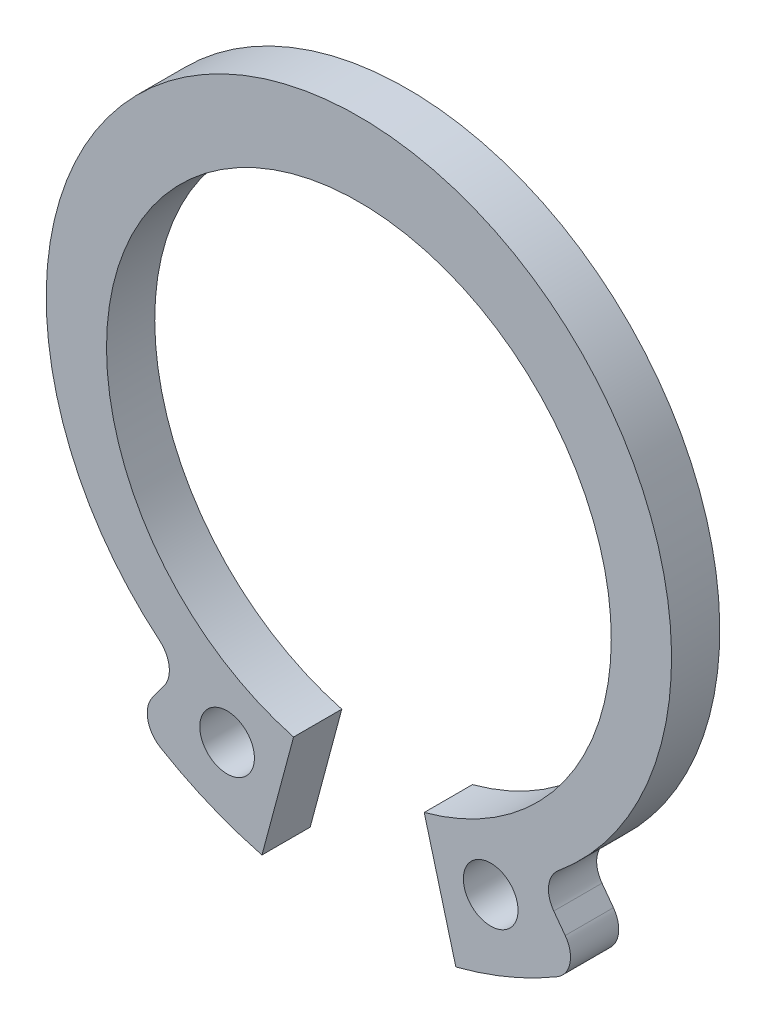
ISO-10303-21;
HEADER;
FILE_DESCRIPTION(('STEP AP214'),'2;1');
FILE_NAME('part.step','',(''),(''),'','','');
FILE_SCHEMA(('AUTOMOTIVE_DESIGN { 1 0 10303 214 1 1 1 1 }'));
ENDSEC;
DATA;
#1=APPLICATION_CONTEXT('core data for automotive mechanical design processes');
#2=APPLICATION_PROTOCOL_DEFINITION('international standard','automotive_design',2000,#1);
#3=PRODUCT_CONTEXT('',#1,'mechanical');
#4=PRODUCT('Part','Part','',(#3));
#5=PRODUCT_RELATED_PRODUCT_CATEGORY('part','',(#4));
#6=PRODUCT_DEFINITION_FORMATION('','',#4);
#7=PRODUCT_DEFINITION_CONTEXT('part definition',#1,'design');
#8=PRODUCT_DEFINITION('design','',#6,#7);
#9=PRODUCT_DEFINITION_SHAPE('','',#8);
#10=(LENGTH_UNIT() NAMED_UNIT(*) SI_UNIT(.MILLI.,.METRE.));
#11=(NAMED_UNIT(*) PLANE_ANGLE_UNIT() SI_UNIT($,.RADIAN.));
#12=(NAMED_UNIT(*) SI_UNIT($,.STERADIAN.) SOLID_ANGLE_UNIT());
#13=UNCERTAINTY_MEASURE_WITH_UNIT(LENGTH_MEASURE(1.E-05),#10,'distance_accuracy_value','');
#14=(GEOMETRIC_REPRESENTATION_CONTEXT(3) GLOBAL_UNCERTAINTY_ASSIGNED_CONTEXT((#13)) GLOBAL_UNIT_ASSIGNED_CONTEXT((#10,
#11,#12)) REPRESENTATION_CONTEXT('',''));
#15=CARTESIAN_POINT('',(0.,0.,0.));
#16=DIRECTION('',(0.,0.,1.));
#17=DIRECTION('',(1.,0.,0.));
#18=AXIS2_PLACEMENT_3D('',#15,#16,#17);
#19=CARTESIAN_POINT('',(-6.74585074112684,-7.71896235124148,1.5));
#20=DIRECTION('',(0.,0.,-1.));
#21=DIRECTION('',(-1.,0.,0.));
#22=AXIS2_PLACEMENT_3D('',#19,#20,#21);
#23=PLANE('',#22);
#24=CARTESIAN_POINT('',(4.09950189445806,-8.76125183465633,1.5));
#25=DIRECTION('',(0.,0.,1.));
#26=DIRECTION('',(1.,0.,0.));
#27=AXIS2_PLACEMENT_3D('',#24,#25,#26);
#28=CIRCLE('',#27,0.85);
#29=CARTESIAN_POINT('',(4.94950189445806,-8.76125183465633,1.5));
#30=VERTEX_POINT('',#29);
#31=EDGE_CURVE('E139',#30,#30,#28,.T.);
#32=ORIENTED_EDGE('',*,*,#31,.F.);
#33=EDGE_LOOP('',(#32));
#34=FACE_BOUND('',#33,.T.);
#35=CARTESIAN_POINT('',(-6.74585074112684,-7.71896235124148,1.5));
#36=DIRECTION('',(0.,0.,-1.));
#37=DIRECTION('',(-1.,0.,0.));
#38=AXIS2_PLACEMENT_3D('',#35,#36,#37);
#39=CIRCLE('',#38,0.849999999999999);
#40=CARTESIAN_POINT('',(-6.20363105980696,-7.06436490456959,1.5));
#41=VERTEX_POINT('',#40);
#42=CARTESIAN_POINT('',(-6.06164733846507,-8.22330916027874,1.5));
#43=VERTEX_POINT('',#42);
#44=EDGE_CURVE('E165',#41,#43,#39,.T.);
#45=ORIENTED_EDGE('',*,*,#44,.T.);
#46=DIRECTION('',(-0.593349187102657,-0.804945179602076,0.));
#47=VECTOR('',#46,1.);
#48=CARTESIAN_POINT('',(-6.06164733846507,-8.22330916027874,1.5));
#49=LINE('',#48,#47);
#50=CARTESIAN_POINT('',(-6.41683923197664,-8.70516707587138,1.5));
#51=VERTEX_POINT('',#50);
#52=EDGE_CURVE('E134',#43,#51,#49,.T.);
#53=ORIENTED_EDGE('',*,*,#52,.T.);
#54=CARTESIAN_POINT('',(-5.73263582931488,-9.20951388490864,1.5));
#55=DIRECTION('',(0.,0.,1.));
#56=DIRECTION('',(-1.,0.,0.));
#57=AXIS2_PLACEMENT_3D('',#54,#55,#56);
#58=CIRCLE('',#57,0.850000000000001);
#59=CARTESIAN_POINT('',(-6.16727428486132,-9.93998593294347,1.5));
#60=VERTEX_POINT('',#59);
#61=EDGE_CURVE('E168',#51,#60,#58,.T.);
#62=ORIENTED_EDGE('',*,*,#61,.T.);
#63=CARTESIAN_POINT('',(0.,0.425,1.5));
#64=DIRECTION('',(0.,0.,1.));
#65=DIRECTION('',(1.,0.,0.));
#66=AXIS2_PLACEMENT_3D('',#63,#64,#65);
#67=CIRCLE('',#66,12.0610200851681);
#68=CARTESIAN_POINT('',(-3.01524187544438,-11.2530358762677,1.5));
#69=VERTEX_POINT('',#68);
#70=EDGE_CURVE('E170',#60,#69,#67,.T.);
#71=ORIENTED_EDGE('',*,*,#70,.T.);
#72=DIRECTION('',(0.258819045102522,0.965925826289069,0.));
#73=VECTOR('',#72,1.);
#74=CARTESIAN_POINT('',(-2.03172950405479,-7.58251773636919,1.5));
#75=LINE('',#74,#73);
#76=CARTESIAN_POINT('',(-2.03172950405479,-7.58251773636919,1.5));
#77=VERTEX_POINT('',#76);
#78=EDGE_CURVE('E172',#69,#77,#75,.T.);
#79=ORIENTED_EDGE('',*,*,#78,.T.);
#80=CARTESIAN_POINT('',(0.,0.,1.5));
#81=DIRECTION('',(0.,0.,-1.));
#82=DIRECTION('',(1.,0.,0.));
#83=AXIS2_PLACEMENT_3D('',#80,#81,#82);
#84=CIRCLE('',#83,7.85);
#85=CARTESIAN_POINT('',(2.03172950405479,-7.58251773636919,1.5));
#86=VERTEX_POINT('',#85);
#87=EDGE_CURVE('E174',#77,#86,#84,.T.);
#88=ORIENTED_EDGE('',*,*,#87,.T.);
#89=DIRECTION('',(0.258819045102522,-0.965925826289069,0.));
#90=VECTOR('',#89,1.);
#91=CARTESIAN_POINT('',(2.03172950405479,-7.58251773636919,1.5));
#92=LINE('',#91,#90);
#93=CARTESIAN_POINT('',(3.01524187544438,-11.2530358762677,1.5));
#94=VERTEX_POINT('',#93);
#95=EDGE_CURVE('E176',#86,#94,#92,.T.);
#96=ORIENTED_EDGE('',*,*,#95,.T.);
#97=CARTESIAN_POINT('',(0.,0.425,1.5));
#98=DIRECTION('',(0.,0.,1.));
#99=DIRECTION('',(1.,0.,0.));
#100=AXIS2_PLACEMENT_3D('',#97,#98,#99);
#101=CIRCLE('',#100,12.0610200851681);
#102=CARTESIAN_POINT('',(6.16727428486133,-9.93998593294347,1.5));
#103=VERTEX_POINT('',#102);
#104=EDGE_CURVE('E178',#94,#103,#101,.T.);
#105=ORIENTED_EDGE('',*,*,#104,.T.);
#106=CARTESIAN_POINT('',(5.73263582931488,-9.20951388490863,1.5));
#107=DIRECTION('',(0.,0.,1.));
#108=DIRECTION('',(1.,0.,0.));
#109=AXIS2_PLACEMENT_3D('',#106,#107,#108);
#110=CIRCLE('',#109,0.850000000000001);
#111=CARTESIAN_POINT('',(6.41683923197664,-8.70516707587137,1.5));
#112=VERTEX_POINT('',#111);
#113=EDGE_CURVE('E180',#103,#112,#110,.T.);
#114=ORIENTED_EDGE('',*,*,#113,.T.);
#115=DIRECTION('',(-0.593349187102657,0.804945179602075,0.));
#116=VECTOR('',#115,1.);
#117=CARTESIAN_POINT('',(6.06164733846507,-8.22330916027874,1.5));
#118=LINE('',#117,#116);
#119=CARTESIAN_POINT('',(6.06164733846507,-8.22330916027874,1.5));
#120=VERTEX_POINT('',#119);
#121=EDGE_CURVE('E182',#112,#120,#118,.T.);
#122=ORIENTED_EDGE('',*,*,#121,.T.);
#123=CARTESIAN_POINT('',(6.74585074112684,-7.71896235124149,1.5));
#124=DIRECTION('',(0.,0.,-1.));
#125=DIRECTION('',(1.,0.,0.));
#126=AXIS2_PLACEMENT_3D('',#123,#124,#125);
#127=CIRCLE('',#126,0.849999999999999);
#128=CARTESIAN_POINT('',(6.20363105980695,-7.06436490456959,1.5));
#129=VERTEX_POINT('',#128);
#130=EDGE_CURVE('E51',#120,#129,#127,.T.);
#131=ORIENTED_EDGE('',*,*,#130,.T.);
#132=CARTESIAN_POINT('',(0.,0.425,1.5));
#133=DIRECTION('',(0.,0.,1.));
#134=DIRECTION('',(1.,0.,0.));
#135=AXIS2_PLACEMENT_3D('',#132,#133,#134);
#136=CIRCLE('',#135,9.725);
#137=EDGE_CURVE('E46',#129,#41,#136,.T.);
#138=ORIENTED_EDGE('',*,*,#137,.T.);
#139=EDGE_LOOP('',(#45,#53,#62,#71,#79,#88,#96,#105,#114,#122,#131,#138));
#140=FACE_BOUND('',#139,.T.);
#141=CARTESIAN_POINT('',(-4.09950189445806,-8.76125183465633,1.5));
#142=DIRECTION('',(0.,0.,1.));
#143=DIRECTION('',(-1.,0.,0.));
#144=AXIS2_PLACEMENT_3D('',#141,#142,#143);
#145=CIRCLE('',#144,0.85);
#146=CARTESIAN_POINT('',(-4.94950189445806,-8.76125183465633,1.5));
#147=VERTEX_POINT('',#146);
#148=EDGE_CURVE('E285',#147,#147,#145,.T.);
#149=ORIENTED_EDGE('',*,*,#148,.F.);
#150=EDGE_LOOP('',(#149));
#151=FACE_BOUND('',#150,.T.);
#152=ADVANCED_FACE('F31',(#34,#140,#151),#23,.F.);
#153=CARTESIAN_POINT('',(-6.74585074112684,-7.71896235124148,0.));
#154=DIRECTION('',(0.,0.,-1.));
#155=DIRECTION('',(-1.,0.,0.));
#156=AXIS2_PLACEMENT_3D('',#153,#154,#155);
#157=PLANE('',#156);
#158=CARTESIAN_POINT('',(4.09950189445806,-8.76125183465633,0.));
#159=DIRECTION('',(0.,0.,1.));
#160=DIRECTION('',(1.,0.,0.));
#161=AXIS2_PLACEMENT_3D('',#158,#159,#160);
#162=CIRCLE('',#161,0.85);
#163=CARTESIAN_POINT('',(4.94950189445806,-8.76125183465633,0.));
#164=VERTEX_POINT('',#163);
#165=EDGE_CURVE('E142',#164,#164,#162,.T.);
#166=ORIENTED_EDGE('',*,*,#165,.T.);
#167=EDGE_LOOP('',(#166));
#168=FACE_BOUND('',#167,.T.);
#169=CARTESIAN_POINT('',(-6.74585074112684,-7.71896235124148,0.));
#170=DIRECTION('',(0.,0.,-1.));
#171=DIRECTION('',(-1.,0.,0.));
#172=AXIS2_PLACEMENT_3D('',#169,#170,#171);
#173=CIRCLE('',#172,0.849999999999999);
#174=CARTESIAN_POINT('',(-6.20363105980696,-7.06436490456959,0.));
#175=VERTEX_POINT('',#174);
#176=CARTESIAN_POINT('',(-6.06164733846507,-8.22330916027874,0.));
#177=VERTEX_POINT('',#176);
#178=EDGE_CURVE('E125',#175,#177,#173,.T.);
#179=ORIENTED_EDGE('',*,*,#178,.F.);
#180=CARTESIAN_POINT('',(0.,0.425,0.));
#181=DIRECTION('',(0.,0.,1.));
#182=DIRECTION('',(1.,0.,0.));
#183=AXIS2_PLACEMENT_3D('',#180,#181,#182);
#184=CIRCLE('',#183,9.725);
#185=CARTESIAN_POINT('',(6.20363105980695,-7.06436490456959,0.));
#186=VERTEX_POINT('',#185);
#187=EDGE_CURVE('E163',#186,#175,#184,.T.);
#188=ORIENTED_EDGE('',*,*,#187,.F.);
#189=CARTESIAN_POINT('',(6.74585074112684,-7.71896235124149,0.));
#190=DIRECTION('',(0.,0.,-1.));
#191=DIRECTION('',(1.,0.,0.));
#192=AXIS2_PLACEMENT_3D('',#189,#190,#191);
#193=CIRCLE('',#192,0.849999999999999);
#194=CARTESIAN_POINT('',(6.06164733846507,-8.22330916027874,0.));
#195=VERTEX_POINT('',#194);
#196=EDGE_CURVE('E161',#195,#186,#193,.T.);
#197=ORIENTED_EDGE('',*,*,#196,.F.);
#198=DIRECTION('',(-0.593349187102657,0.804945179602075,0.));
#199=VECTOR('',#198,1.);
#200=CARTESIAN_POINT('',(6.06164733846507,-8.22330916027874,0.));
#201=LINE('',#200,#199);
#202=CARTESIAN_POINT('',(6.41683923197664,-8.70516707587137,0.));
#203=VERTEX_POINT('',#202);
#204=EDGE_CURVE('E159',#203,#195,#201,.T.);
#205=ORIENTED_EDGE('',*,*,#204,.F.);
#206=CARTESIAN_POINT('',(5.73263582931488,-9.20951388490863,0.));
#207=DIRECTION('',(0.,0.,1.));
#208=DIRECTION('',(1.,0.,0.));
#209=AXIS2_PLACEMENT_3D('',#206,#207,#208);
#210=CIRCLE('',#209,0.850000000000001);
#211=CARTESIAN_POINT('',(6.16727428486133,-9.93998593294347,0.));
#212=VERTEX_POINT('',#211);
#213=EDGE_CURVE('E157',#212,#203,#210,.T.);
#214=ORIENTED_EDGE('',*,*,#213,.F.);
#215=CARTESIAN_POINT('',(0.,0.425,0.));
#216=DIRECTION('',(0.,0.,1.));
#217=DIRECTION('',(1.,0.,0.));
#218=AXIS2_PLACEMENT_3D('',#215,#216,#217);
#219=CIRCLE('',#218,12.0610200851681);
#220=CARTESIAN_POINT('',(3.01524187544438,-11.2530358762677,0.));
#221=VERTEX_POINT('',#220);
#222=EDGE_CURVE('E155',#221,#212,#219,.T.);
#223=ORIENTED_EDGE('',*,*,#222,.F.);
#224=DIRECTION('',(0.258819045102522,-0.965925826289069,0.));
#225=VECTOR('',#224,1.);
#226=CARTESIAN_POINT('',(2.03172950405479,-7.58251773636919,0.));
#227=LINE('',#226,#225);
#228=CARTESIAN_POINT('',(2.03172950405479,-7.58251773636919,0.));
#229=VERTEX_POINT('',#228);
#230=EDGE_CURVE('E153',#229,#221,#227,.T.);
#231=ORIENTED_EDGE('',*,*,#230,.F.);
#232=CARTESIAN_POINT('',(0.,0.,0.));
#233=DIRECTION('',(0.,0.,-1.));
#234=DIRECTION('',(1.,0.,0.));
#235=AXIS2_PLACEMENT_3D('',#232,#233,#234);
#236=CIRCLE('',#235,7.85);
#237=CARTESIAN_POINT('',(-2.03172950405479,-7.58251773636919,0.));
#238=VERTEX_POINT('',#237);
#239=EDGE_CURVE('E151',#238,#229,#236,.T.);
#240=ORIENTED_EDGE('',*,*,#239,.F.);
#241=DIRECTION('',(0.258819045102522,0.965925826289069,0.));
#242=VECTOR('',#241,1.);
#243=CARTESIAN_POINT('',(-2.03172950405479,-7.58251773636919,0.));
#244=LINE('',#243,#242);
#245=CARTESIAN_POINT('',(-3.01524187544438,-11.2530358762677,0.));
#246=VERTEX_POINT('',#245);
#247=EDGE_CURVE('E149',#246,#238,#244,.T.);
#248=ORIENTED_EDGE('',*,*,#247,.F.);
#249=CARTESIAN_POINT('',(0.,0.425,0.));
#250=DIRECTION('',(0.,0.,1.));
#251=DIRECTION('',(1.,0.,0.));
#252=AXIS2_PLACEMENT_3D('',#249,#250,#251);
#253=CIRCLE('',#252,12.0610200851681);
#254=CARTESIAN_POINT('',(-6.16727428486132,-9.93998593294347,0.));
#255=VERTEX_POINT('',#254);
#256=EDGE_CURVE('E147',#255,#246,#253,.T.);
#257=ORIENTED_EDGE('',*,*,#256,.F.);
#258=CARTESIAN_POINT('',(-5.73263582931488,-9.20951388490864,0.));
#259=DIRECTION('',(0.,0.,1.));
#260=DIRECTION('',(-1.,0.,0.));
#261=AXIS2_PLACEMENT_3D('',#258,#259,#260);
#262=CIRCLE('',#261,0.850000000000001);
#263=CARTESIAN_POINT('',(-6.41683923197664,-8.70516707587138,0.));
#264=VERTEX_POINT('',#263);
#265=EDGE_CURVE('E127',#264,#255,#262,.T.);
#266=ORIENTED_EDGE('',*,*,#265,.F.);
#267=DIRECTION('',(-0.593349187102657,-0.804945179602076,0.));
#268=VECTOR('',#267,1.);
#269=CARTESIAN_POINT('',(-6.06164733846507,-8.22330916027874,0.));
#270=LINE('',#269,#268);
#271=EDGE_CURVE('E120',#177,#264,#270,.T.);
#272=ORIENTED_EDGE('',*,*,#271,.F.);
#273=EDGE_LOOP('',(#179,#188,#197,#205,#214,#223,#231,#240,#248,#257,#266,#272));
#274=FACE_BOUND('',#273,.T.);
#275=CARTESIAN_POINT('',(-4.09950189445806,-8.76125183465633,0.));
#276=DIRECTION('',(0.,0.,1.));
#277=DIRECTION('',(-1.,0.,0.));
#278=AXIS2_PLACEMENT_3D('',#275,#276,#277);
#279=CIRCLE('',#278,0.85);
#280=CARTESIAN_POINT('',(-4.94950189445806,-8.76125183465633,0.));
#281=VERTEX_POINT('',#280);
#282=EDGE_CURVE('E288',#281,#281,#279,.T.);
#283=ORIENTED_EDGE('',*,*,#282,.T.);
#284=EDGE_LOOP('',(#283));
#285=FACE_BOUND('',#284,.T.);
#286=ADVANCED_FACE('F121',(#168,#274,#285),#157,.T.);
#287=CARTESIAN_POINT('',(-6.74585074112684,-7.71896235124148,1.5));
#288=DIRECTION('',(0.,0.,-1.));
#289=DIRECTION('',(-1.,0.,0.));
#290=AXIS2_PLACEMENT_3D('',#287,#288,#289);
#291=CYLINDRICAL_SURFACE('',#290,0.849999999999999);
#292=ORIENTED_EDGE('',*,*,#178,.T.);
#293=DIRECTION('',(0.,0.,-1.));
#294=VECTOR('',#293,1.);
#295=CARTESIAN_POINT('',(-6.06164733846507,-8.22330916027874,1.5));
#296=LINE('',#295,#294);
#297=EDGE_CURVE('E11',#43,#177,#296,.T.);
#298=ORIENTED_EDGE('',*,*,#297,.F.);
#299=ORIENTED_EDGE('',*,*,#44,.F.);
#300=DIRECTION('',(0.,0.,-1.));
#301=VECTOR('',#300,1.);
#302=CARTESIAN_POINT('',(-6.20363105980696,-7.06436490456959,1.5));
#303=LINE('',#302,#301);
#304=EDGE_CURVE('E138',#41,#175,#303,.T.);
#305=ORIENTED_EDGE('',*,*,#304,.T.);
#306=EDGE_LOOP('',(#292,#298,#299,#305));
#307=FACE_BOUND('',#306,.T.);
#308=ADVANCED_FACE('F33',(#307),#291,.F.);
#309=CARTESIAN_POINT('',(-6.06164733846507,-8.22330916027874,1.5));
#310=DIRECTION('',(0.804945179602076,-0.593349187102656,0.));
#311=DIRECTION('',(0.593349187102656,0.804945179602076,0.));
#312=AXIS2_PLACEMENT_3D('',#309,#310,#311);
#313=PLANE('',#312);
#314=ORIENTED_EDGE('',*,*,#271,.T.);
#315=DIRECTION('',(0.,0.,-1.));
#316=VECTOR('',#315,1.);
#317=CARTESIAN_POINT('',(-6.41683923197664,-8.70516707587138,1.5));
#318=LINE('',#317,#316);
#319=EDGE_CURVE('E39',#51,#264,#318,.T.);
#320=ORIENTED_EDGE('',*,*,#319,.F.);
#321=ORIENTED_EDGE('',*,*,#52,.F.);
#322=ORIENTED_EDGE('',*,*,#297,.T.);
#323=EDGE_LOOP('',(#314,#320,#321,#322));
#324=FACE_BOUND('',#323,.T.);
#325=ADVANCED_FACE('F133',(#324),#313,.F.);
#326=CARTESIAN_POINT('',(-5.73263582931488,-9.20951388490864,1.5));
#327=DIRECTION('',(0.,0.,-1.));
#328=DIRECTION('',(-1.,0.,0.));
#329=AXIS2_PLACEMENT_3D('',#326,#327,#328);
#330=CYLINDRICAL_SURFACE('',#329,0.850000000000001);
#331=ORIENTED_EDGE('',*,*,#265,.T.);
#332=DIRECTION('',(0.,0.,-1.));
#333=VECTOR('',#332,1.);
#334=CARTESIAN_POINT('',(-6.16727428486132,-9.93998593294347,1.5));
#335=LINE('',#334,#333);
#336=EDGE_CURVE('E211',#60,#255,#335,.T.);
#337=ORIENTED_EDGE('',*,*,#336,.F.);
#338=ORIENTED_EDGE('',*,*,#61,.F.);
#339=ORIENTED_EDGE('',*,*,#319,.T.);
#340=EDGE_LOOP('',(#331,#337,#338,#339));
#341=FACE_BOUND('',#340,.T.);
#342=ADVANCED_FACE('F215',(#341),#330,.T.);
#343=CARTESIAN_POINT('',(0.,0.425,1.5));
#344=DIRECTION('',(0.,0.,-1.));
#345=DIRECTION('',(-1.,0.,0.));
#346=AXIS2_PLACEMENT_3D('',#343,#344,#345);
#347=CYLINDRICAL_SURFACE('',#346,12.0610200851681);
#348=ORIENTED_EDGE('',*,*,#256,.T.);
#349=DIRECTION('',(0.,0.,-1.));
#350=VECTOR('',#349,1.);
#351=CARTESIAN_POINT('',(-3.01524187544438,-11.2530358762677,1.5));
#352=LINE('',#351,#350);
#353=EDGE_CURVE('E208',#69,#246,#352,.T.);
#354=ORIENTED_EDGE('',*,*,#353,.F.);
#355=ORIENTED_EDGE('',*,*,#70,.F.);
#356=ORIENTED_EDGE('',*,*,#336,.T.);
#357=EDGE_LOOP('',(#348,#354,#355,#356));
#358=FACE_BOUND('',#357,.T.);
#359=ADVANCED_FACE('F223',(#358),#347,.T.);
#360=CARTESIAN_POINT('',(-2.03172950405479,-7.58251773636919,1.5));
#361=DIRECTION('',(-0.965925826289069,0.258819045102522,0.));
#362=DIRECTION('',(-0.258819045102522,-0.965925826289069,0.));
#363=AXIS2_PLACEMENT_3D('',#360,#361,#362);
#364=PLANE('',#363);
#365=ORIENTED_EDGE('',*,*,#247,.T.);
#366=DIRECTION('',(0.,0.,-1.));
#367=VECTOR('',#366,1.);
#368=CARTESIAN_POINT('',(-2.03172950405479,-7.58251773636919,1.5));
#369=LINE('',#368,#367);
#370=EDGE_CURVE('E205',#77,#238,#369,.T.);
#371=ORIENTED_EDGE('',*,*,#370,.F.);
#372=ORIENTED_EDGE('',*,*,#78,.F.);
#373=ORIENTED_EDGE('',*,*,#353,.T.);
#374=EDGE_LOOP('',(#365,#371,#372,#373));
#375=FACE_BOUND('',#374,.T.);
#376=ADVANCED_FACE('F226',(#375),#364,.F.);
#377=CARTESIAN_POINT('',(0.,0.,1.5));
#378=DIRECTION('',(0.,0.,-1.));
#379=DIRECTION('',(-1.,0.,0.));
#380=AXIS2_PLACEMENT_3D('',#377,#378,#379);
#381=CYLINDRICAL_SURFACE('',#380,7.85);
#382=ORIENTED_EDGE('',*,*,#239,.T.);
#383=DIRECTION('',(0.,0.,-1.));
#384=VECTOR('',#383,1.);
#385=CARTESIAN_POINT('',(2.03172950405479,-7.58251773636919,1.5));
#386=LINE('',#385,#384);
#387=EDGE_CURVE('E202',#86,#229,#386,.T.);
#388=ORIENTED_EDGE('',*,*,#387,.F.);
#389=ORIENTED_EDGE('',*,*,#87,.F.);
#390=ORIENTED_EDGE('',*,*,#370,.T.);
#391=EDGE_LOOP('',(#382,#388,#389,#390));
#392=FACE_BOUND('',#391,.T.);
#393=ADVANCED_FACE('F231',(#392),#381,.F.);
#394=CARTESIAN_POINT('',(2.03172950405479,-7.58251773636919,1.5));
#395=DIRECTION('',(0.965925826289069,0.258819045102522,0.));
#396=DIRECTION('',(-0.258819045102522,0.965925826289069,0.));
#397=AXIS2_PLACEMENT_3D('',#394,#395,#396);
#398=PLANE('',#397);
#399=ORIENTED_EDGE('',*,*,#230,.T.);
#400=DIRECTION('',(0.,0.,-1.));
#401=VECTOR('',#400,1.);
#402=CARTESIAN_POINT('',(3.01524187544438,-11.2530358762677,1.5));
#403=LINE('',#402,#401);
#404=EDGE_CURVE('E199',#94,#221,#403,.T.);
#405=ORIENTED_EDGE('',*,*,#404,.F.);
#406=ORIENTED_EDGE('',*,*,#95,.F.);
#407=ORIENTED_EDGE('',*,*,#387,.T.);
#408=EDGE_LOOP('',(#399,#405,#406,#407));
#409=FACE_BOUND('',#408,.T.);
#410=ADVANCED_FACE('F237',(#409),#398,.F.);
#411=CARTESIAN_POINT('',(0.,0.425,1.5));
#412=DIRECTION('',(0.,0.,-1.));
#413=DIRECTION('',(-1.,0.,0.));
#414=AXIS2_PLACEMENT_3D('',#411,#412,#413);
#415=CYLINDRICAL_SURFACE('',#414,12.0610200851681);
#416=ORIENTED_EDGE('',*,*,#222,.T.);
#417=DIRECTION('',(0.,0.,-1.));
#418=VECTOR('',#417,1.);
#419=CARTESIAN_POINT('',(6.16727428486133,-9.93998593294347,1.5));
#420=LINE('',#419,#418);
#421=EDGE_CURVE('E196',#103,#212,#420,.T.);
#422=ORIENTED_EDGE('',*,*,#421,.F.);
#423=ORIENTED_EDGE('',*,*,#104,.F.);
#424=ORIENTED_EDGE('',*,*,#404,.T.);
#425=EDGE_LOOP('',(#416,#422,#423,#424));
#426=FACE_BOUND('',#425,.T.);
#427=ADVANCED_FACE('F241',(#426),#415,.T.);
#428=CARTESIAN_POINT('',(5.73263582931488,-9.20951388490863,1.5));
#429=DIRECTION('',(0.,0.,-1.));
#430=DIRECTION('',(-1.,0.,0.));
#431=AXIS2_PLACEMENT_3D('',#428,#429,#430);
#432=CYLINDRICAL_SURFACE('',#431,0.850000000000001);
#433=ORIENTED_EDGE('',*,*,#213,.T.);
#434=DIRECTION('',(0.,0.,-1.));
#435=VECTOR('',#434,1.);
#436=CARTESIAN_POINT('',(6.41683923197664,-8.70516707587137,1.5));
#437=LINE('',#436,#435);
#438=EDGE_CURVE('E193',#112,#203,#437,.T.);
#439=ORIENTED_EDGE('',*,*,#438,.F.);
#440=ORIENTED_EDGE('',*,*,#113,.F.);
#441=ORIENTED_EDGE('',*,*,#421,.T.);
#442=EDGE_LOOP('',(#433,#439,#440,#441));
#443=FACE_BOUND('',#442,.T.);
#444=ADVANCED_FACE('F246',(#443),#432,.T.);
#445=CARTESIAN_POINT('',(6.06164733846507,-8.22330916027874,1.5));
#446=DIRECTION('',(-0.804945179602075,-0.593349187102657,0.));
#447=DIRECTION('',(0.593349187102657,-0.804945179602075,0.));
#448=AXIS2_PLACEMENT_3D('',#445,#446,#447);
#449=PLANE('',#448);
#450=ORIENTED_EDGE('',*,*,#204,.T.);
#451=DIRECTION('',(0.,0.,-1.));
#452=VECTOR('',#451,1.);
#453=CARTESIAN_POINT('',(6.06164733846507,-8.22330916027874,1.5));
#454=LINE('',#453,#452);
#455=EDGE_CURVE('E190',#120,#195,#454,.T.);
#456=ORIENTED_EDGE('',*,*,#455,.F.);
#457=ORIENTED_EDGE('',*,*,#121,.F.);
#458=ORIENTED_EDGE('',*,*,#438,.T.);
#459=EDGE_LOOP('',(#450,#456,#457,#458));
#460=FACE_BOUND('',#459,.T.);
#461=ADVANCED_FACE('F250',(#460),#449,.F.);
#462=CARTESIAN_POINT('',(6.74585074112684,-7.71896235124149,1.5));
#463=DIRECTION('',(0.,0.,-1.));
#464=DIRECTION('',(-1.,0.,0.));
#465=AXIS2_PLACEMENT_3D('',#462,#463,#464);
#466=CYLINDRICAL_SURFACE('',#465,0.849999999999999);
#467=ORIENTED_EDGE('',*,*,#196,.T.);
#468=DIRECTION('',(0.,0.,-1.));
#469=VECTOR('',#468,1.);
#470=CARTESIAN_POINT('',(6.20363105980695,-7.06436490456959,1.5));
#471=LINE('',#470,#469);
#472=EDGE_CURVE('E187',#129,#186,#471,.T.);
#473=ORIENTED_EDGE('',*,*,#472,.F.);
#474=ORIENTED_EDGE('',*,*,#130,.F.);
#475=ORIENTED_EDGE('',*,*,#455,.T.);
#476=EDGE_LOOP('',(#467,#473,#474,#475));
#477=FACE_BOUND('',#476,.T.);
#478=ADVANCED_FACE('F254',(#477),#466,.F.);
#479=CARTESIAN_POINT('',(0.,0.425,1.5));
#480=DIRECTION('',(0.,0.,-1.));
#481=DIRECTION('',(-1.,0.,0.));
#482=AXIS2_PLACEMENT_3D('',#479,#480,#481);
#483=CYLINDRICAL_SURFACE('',#482,9.725);
#484=ORIENTED_EDGE('',*,*,#187,.T.);
#485=ORIENTED_EDGE('',*,*,#304,.F.);
#486=ORIENTED_EDGE('',*,*,#137,.F.);
#487=ORIENTED_EDGE('',*,*,#472,.T.);
#488=EDGE_LOOP('',(#484,#485,#486,#487));
#489=FACE_BOUND('',#488,.T.);
#490=ADVANCED_FACE('F256',(#489),#483,.T.);
#491=CARTESIAN_POINT('',(4.09950189445806,-8.76125183465633,1.5));
#492=DIRECTION('',(0.,0.,-1.));
#493=DIRECTION('',(-1.,0.,0.));
#494=AXIS2_PLACEMENT_3D('',#491,#492,#493);
#495=CYLINDRICAL_SURFACE('',#494,0.85);
#496=ORIENTED_EDGE('',*,*,#31,.T.);
#497=EDGE_LOOP('',(#496));
#498=FACE_BOUND('',#497,.T.);
#499=ORIENTED_EDGE('',*,*,#165,.F.);
#500=EDGE_LOOP('',(#499));
#501=FACE_BOUND('',#500,.T.);
#502=ADVANCED_FACE('F258',(#498,#501),#495,.F.);
#503=CARTESIAN_POINT('',(-4.09950189445806,-8.76125183465633,1.5));
#504=DIRECTION('',(0.,0.,-1.));
#505=DIRECTION('',(-1.,0.,0.));
#506=AXIS2_PLACEMENT_3D('',#503,#504,#505);
#507=CYLINDRICAL_SURFACE('',#506,0.85);
#508=ORIENTED_EDGE('',*,*,#148,.T.);
#509=EDGE_LOOP('',(#508));
#510=FACE_BOUND('',#509,.T.);
#511=ORIENTED_EDGE('',*,*,#282,.F.);
#512=EDGE_LOOP('',(#511));
#513=FACE_BOUND('',#512,.T.);
#514=ADVANCED_FACE('F264',(#510,#513),#507,.F.);
#515=CLOSED_SHELL('',(#152,#286,#308,#325,#342,#359,#376,#393,#410,#427,#444,#461,#478,#490,
#502,#514));
#516=MANIFOLD_SOLID_BREP('B2',#515);
#517=ADVANCED_BREP_SHAPE_REPRESENTATION('',(#18,#516),#14);
#518=SHAPE_DEFINITION_REPRESENTATION(#9,#517);
ENDSEC;
END-ISO-10303-21;
